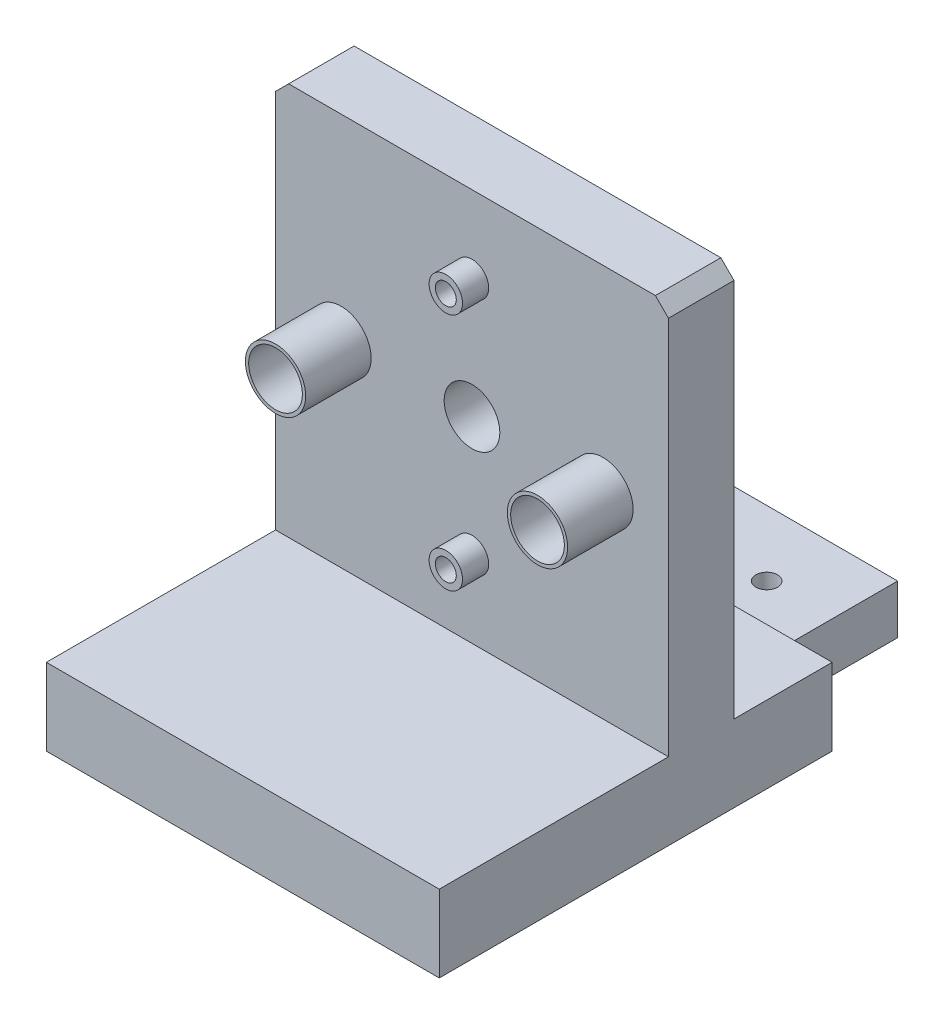
ISO-10303-21;
HEADER;
FILE_DESCRIPTION(('STEP AP214'),'2;1');
FILE_NAME('part.step','',(''),(''),'','','');
FILE_SCHEMA(('AUTOMOTIVE_DESIGN { 1 0 10303 214 1 1 1 1 }'));
ENDSEC;
DATA;
#1=APPLICATION_CONTEXT('core data for automotive mechanical design processes');
#2=APPLICATION_PROTOCOL_DEFINITION('international standard','automotive_design',2000,#1);
#3=PRODUCT_CONTEXT('',#1,'mechanical');
#4=PRODUCT('Part','Part','',(#3));
#5=PRODUCT_RELATED_PRODUCT_CATEGORY('part','',(#4));
#6=PRODUCT_DEFINITION_FORMATION('','',#4);
#7=PRODUCT_DEFINITION_CONTEXT('part definition',#1,'design');
#8=PRODUCT_DEFINITION('design','',#6,#7);
#9=PRODUCT_DEFINITION_SHAPE('','',#8);
#10=(LENGTH_UNIT() NAMED_UNIT(*) SI_UNIT(.MILLI.,.METRE.));
#11=(NAMED_UNIT(*) PLANE_ANGLE_UNIT() SI_UNIT($,.RADIAN.));
#12=(NAMED_UNIT(*) SI_UNIT($,.STERADIAN.) SOLID_ANGLE_UNIT());
#13=UNCERTAINTY_MEASURE_WITH_UNIT(LENGTH_MEASURE(1.E-05),#10,'distance_accuracy_value','');
#14=(GEOMETRIC_REPRESENTATION_CONTEXT(3) GLOBAL_UNCERTAINTY_ASSIGNED_CONTEXT((#13)) GLOBAL_UNIT_ASSIGNED_CONTEXT((#10,
#11,#12)) REPRESENTATION_CONTEXT('',''));
#15=CARTESIAN_POINT('',(0.,0.,0.));
#16=DIRECTION('',(0.,0.,1.));
#17=DIRECTION('',(1.,0.,0.));
#18=AXIS2_PLACEMENT_3D('',#15,#16,#17);
#19=CARTESIAN_POINT('',(-30.,-41.75,-35.));
#20=DIRECTION('',(0.,0.,1.));
#21=DIRECTION('',(1.,0.,0.));
#22=AXIS2_PLACEMENT_3D('',#19,#20,#21);
#23=PLANE('',#22);
#24=DIRECTION('',(-1.,0.,0.));
#25=VECTOR('',#24,1.);
#26=CARTESIAN_POINT('',(-20.,-34.25,-35.));
#27=LINE('',#26,#25);
#28=CARTESIAN_POINT('',(20.,-34.25,-35.));
#29=VERTEX_POINT('',#28);
#30=CARTESIAN_POINT('',(-20.,-34.25,-35.));
#31=VERTEX_POINT('',#30);
#32=EDGE_CURVE('E162',#29,#31,#27,.T.);
#33=ORIENTED_EDGE('',*,*,#32,.F.);
#34=DIRECTION('',(0.,-1.,0.));
#35=VECTOR('',#34,1.);
#36=CARTESIAN_POINT('',(20.,30.,-35.));
#37=LINE('',#36,#35);
#38=CARTESIAN_POINT('',(20.,-41.75,-35.));
#39=VERTEX_POINT('',#38);
#40=EDGE_CURVE('E199',#29,#39,#37,.T.);
#41=ORIENTED_EDGE('',*,*,#40,.T.);
#42=DIRECTION('',(1.,0.,0.));
#43=VECTOR('',#42,1.);
#44=CARTESIAN_POINT('',(-30.,-41.75,-35.));
#45=LINE('',#44,#43);
#46=CARTESIAN_POINT('',(-20.,-41.75,-35.));
#47=VERTEX_POINT('',#46);
#48=EDGE_CURVE('E215',#47,#39,#45,.T.);
#49=ORIENTED_EDGE('',*,*,#48,.F.);
#50=DIRECTION('',(0.,-1.,0.));
#51=VECTOR('',#50,1.);
#52=CARTESIAN_POINT('',(-20.,30.,-35.));
#53=LINE('',#52,#51);
#54=EDGE_CURVE('E174',#31,#47,#53,.T.);
#55=ORIENTED_EDGE('',*,*,#54,.F.);
#56=EDGE_LOOP('',(#33,#41,#49,#55));
#57=FACE_BOUND('',#56,.T.);
#58=ADVANCED_FACE('F40',(#57),#23,.F.);
#59=CARTESIAN_POINT('',(20.,30.,-35.));
#60=DIRECTION('',(-1.,0.,0.));
#61=DIRECTION('',(0.,0.,1.));
#62=AXIS2_PLACEMENT_3D('',#59,#60,#61);
#63=PLANE('',#62);
#64=DIRECTION('',(0.,0.,-1.));
#65=VECTOR('',#64,1.);
#66=CARTESIAN_POINT('',(20.,-34.25,-35.));
#67=LINE('',#66,#65);
#68=CARTESIAN_POINT('',(20.,-34.25,-15.));
#69=VERTEX_POINT('',#68);
#70=EDGE_CURVE('E156',#69,#29,#67,.T.);
#71=ORIENTED_EDGE('',*,*,#70,.F.);
#72=DIRECTION('',(0.,-1.,0.));
#73=VECTOR('',#72,1.);
#74=CARTESIAN_POINT('',(20.,30.,-15.));
#75=LINE('',#74,#73);
#76=CARTESIAN_POINT('',(20.,-41.75,-15.));
#77=VERTEX_POINT('',#76);
#78=EDGE_CURVE('E152',#69,#77,#75,.T.);
#79=ORIENTED_EDGE('',*,*,#78,.T.);
#80=DIRECTION('',(0.,0.,-1.));
#81=VECTOR('',#80,1.);
#82=CARTESIAN_POINT('',(20.,-41.75,-35.));
#83=LINE('',#82,#81);
#84=EDGE_CURVE('E191',#77,#39,#83,.T.);
#85=ORIENTED_EDGE('',*,*,#84,.T.);
#86=ORIENTED_EDGE('',*,*,#40,.F.);
#87=EDGE_LOOP('',(#71,#79,#85,#86));
#88=FACE_BOUND('',#87,.T.);
#89=ADVANCED_FACE('F435',(#88),#63,.F.);
#90=CARTESIAN_POINT('',(-20.,30.,-35.));
#91=DIRECTION('',(1.,0.,0.));
#92=DIRECTION('',(0.,0.,-1.));
#93=AXIS2_PLACEMENT_3D('',#90,#91,#92);
#94=PLANE('',#93);
#95=DIRECTION('',(0.,0.,1.));
#96=VECTOR('',#95,1.);
#97=CARTESIAN_POINT('',(-20.,-34.25,-35.));
#98=LINE('',#97,#96);
#99=CARTESIAN_POINT('',(-20.,-34.25,-15.));
#100=VERTEX_POINT('',#99);
#101=EDGE_CURVE('E157',#31,#100,#98,.T.);
#102=ORIENTED_EDGE('',*,*,#101,.F.);
#103=ORIENTED_EDGE('',*,*,#54,.T.);
#104=DIRECTION('',(0.,0.,1.));
#105=VECTOR('',#104,1.);
#106=CARTESIAN_POINT('',(-20.,-41.75,-35.));
#107=LINE('',#106,#105);
#108=CARTESIAN_POINT('',(-20.,-41.75,-15.));
#109=VERTEX_POINT('',#108);
#110=EDGE_CURVE('E170',#47,#109,#107,.T.);
#111=ORIENTED_EDGE('',*,*,#110,.T.);
#112=DIRECTION('',(0.,-1.,0.));
#113=VECTOR('',#112,1.);
#114=CARTESIAN_POINT('',(-20.,30.,-15.));
#115=LINE('',#114,#113);
#116=EDGE_CURVE('E149',#100,#109,#115,.T.);
#117=ORIENTED_EDGE('',*,*,#116,.F.);
#118=EDGE_LOOP('',(#102,#103,#111,#117));
#119=FACE_BOUND('',#118,.T.);
#120=ADVANCED_FACE('F168',(#119),#94,.F.);
#121=CARTESIAN_POINT('',(0.,0.,10.));
#122=DIRECTION('',(0.,0.,-1.));
#123=DIRECTION('',(-1.,0.,0.));
#124=AXIS2_PLACEMENT_3D('',#121,#122,#123);
#125=PLANE('',#124);
#126=CARTESIAN_POINT('',(0.,-18.25,10.));
#127=DIRECTION('',(0.,0.,-1.));
#128=DIRECTION('',(1.,0.,0.));
#129=AXIS2_PLACEMENT_3D('',#126,#127,#128);
#130=CIRCLE('',#129,2.55);
#131=CARTESIAN_POINT('',(2.55,-18.25,10.));
#132=VERTEX_POINT('',#131);
#133=EDGE_CURVE('E239',#132,#132,#130,.T.);
#134=ORIENTED_EDGE('',*,*,#133,.T.);
#135=EDGE_LOOP('',(#134));
#136=FACE_BOUND('',#135,.T.);
#137=CARTESIAN_POINT('',(-20.,0.,10.));
#138=DIRECTION('',(0.,0.,-1.));
#139=DIRECTION('',(-1.,0.,0.));
#140=AXIS2_PLACEMENT_3D('',#137,#138,#139);
#141=CIRCLE('',#140,4.6);
#142=CARTESIAN_POINT('',(-24.6,0.,10.));
#143=VERTEX_POINT('',#142);
#144=EDGE_CURVE('E330',#143,#143,#141,.F.);
#145=ORIENTED_EDGE('',*,*,#144,.F.);
#146=EDGE_LOOP('',(#145));
#147=FACE_BOUND('',#146,.T.);
#148=CARTESIAN_POINT('',(0.,0.,10.));
#149=DIRECTION('',(0.,0.,1.));
#150=DIRECTION('',(1.,0.,0.));
#151=AXIS2_PLACEMENT_3D('',#148,#149,#150);
#152=CIRCLE('',#151,4.25000000000002);
#153=CARTESIAN_POINT('',(4.25000000000002,0.,10.));
#154=VERTEX_POINT('',#153);
#155=EDGE_CURVE('E307',#154,#154,#152,.T.);
#156=ORIENTED_EDGE('',*,*,#155,.F.);
#157=EDGE_LOOP('',(#156));
#158=FACE_BOUND('',#157,.T.);
#159=DIRECTION('',(-1.,0.,0.));
#160=VECTOR('',#159,1.);
#161=CARTESIAN_POINT('',(-30.,30.,10.));
#162=LINE('',#161,#160);
#163=CARTESIAN_POINT('',(28.,30.,10.));
#164=VERTEX_POINT('',#163);
#165=CARTESIAN_POINT('',(-28.,30.,10.));
#166=VERTEX_POINT('',#165);
#167=EDGE_CURVE('E319',#164,#166,#162,.T.);
#168=ORIENTED_EDGE('',*,*,#167,.T.);
#169=DIRECTION('',(0.707106781186548,0.707106781186548,0.));
#170=VECTOR('',#169,1.);
#171=CARTESIAN_POINT('',(-30.,28.,10.));
#172=LINE('',#171,#170);
#173=CARTESIAN_POINT('',(-30.,28.,10.));
#174=VERTEX_POINT('',#173);
#175=EDGE_CURVE('E50',#166,#174,#172,.F.);
#176=ORIENTED_EDGE('',*,*,#175,.T.);
#177=DIRECTION('',(0.,-1.,0.));
#178=VECTOR('',#177,1.);
#179=CARTESIAN_POINT('',(-30.,-30.,10.));
#180=LINE('',#179,#178);
#181=CARTESIAN_POINT('',(-30.,-30.,10.));
#182=VERTEX_POINT('',#181);
#183=EDGE_CURVE('E323',#174,#182,#180,.T.);
#184=ORIENTED_EDGE('',*,*,#183,.T.);
#185=DIRECTION('',(1.,0.,0.));
#186=VECTOR('',#185,1.);
#187=CARTESIAN_POINT('',(-30.,-30.,10.));
#188=LINE('',#187,#186);
#189=CARTESIAN_POINT('',(30.,-30.,10.));
#190=VERTEX_POINT('',#189);
#191=EDGE_CURVE('E326',#182,#190,#188,.T.);
#192=ORIENTED_EDGE('',*,*,#191,.T.);
#193=DIRECTION('',(0.,1.,0.));
#194=VECTOR('',#193,1.);
#195=CARTESIAN_POINT('',(30.,-30.,10.));
#196=LINE('',#195,#194);
#197=CARTESIAN_POINT('',(30.,28.,10.));
#198=VERTEX_POINT('',#197);
#199=EDGE_CURVE('E316',#190,#198,#196,.T.);
#200=ORIENTED_EDGE('',*,*,#199,.T.);
#201=DIRECTION('',(0.707106781186548,-0.707106781186548,0.));
#202=VECTOR('',#201,1.);
#203=CARTESIAN_POINT('',(28.,30.,10.));
#204=LINE('',#203,#202);
#205=EDGE_CURVE('E374',#198,#164,#204,.F.);
#206=ORIENTED_EDGE('',*,*,#205,.T.);
#207=EDGE_LOOP('',(#168,#176,#184,#192,#200,#206));
#208=FACE_BOUND('',#207,.T.);
#209=CARTESIAN_POINT('',(20.,0.,10.));
#210=DIRECTION('',(0.,0.,-1.));
#211=DIRECTION('',(-1.,0.,0.));
#212=AXIS2_PLACEMENT_3D('',#209,#210,#211);
#213=CIRCLE('',#212,4.6);
#214=CARTESIAN_POINT('',(15.4,0.,10.));
#215=VERTEX_POINT('',#214);
#216=EDGE_CURVE('E260',#215,#215,#213,.T.);
#217=ORIENTED_EDGE('',*,*,#216,.T.);
#218=EDGE_LOOP('',(#217));
#219=FACE_BOUND('',#218,.T.);
#220=CARTESIAN_POINT('',(0.,18.25,10.));
#221=DIRECTION('',(0.,0.,-1.));
#222=DIRECTION('',(-1.,0.,0.));
#223=AXIS2_PLACEMENT_3D('',#220,#221,#222);
#224=CIRCLE('',#223,2.55);
#225=CARTESIAN_POINT('',(-2.55,18.25,10.));
#226=VERTEX_POINT('',#225);
#227=EDGE_CURVE('E345',#226,#226,#224,.F.);
#228=ORIENTED_EDGE('',*,*,#227,.F.);
#229=EDGE_LOOP('',(#228));
#230=FACE_BOUND('',#229,.T.);
#231=ADVANCED_FACE('F380',(#136,#147,#158,#208,#219,#230),#125,.F.);
#232=CARTESIAN_POINT('',(30.,-30.,10.));
#233=DIRECTION('',(-1.,0.,0.));
#234=DIRECTION('',(0.,0.,1.));
#235=AXIS2_PLACEMENT_3D('',#232,#233,#234);
#236=PLANE('',#235);
#237=DIRECTION('',(0.,1.,0.));
#238=VECTOR('',#237,1.);
#239=CARTESIAN_POINT('',(30.,-30.,0.));
#240=LINE('',#239,#238);
#241=CARTESIAN_POINT('',(30.,-30.,0.));
#242=VERTEX_POINT('',#241);
#243=CARTESIAN_POINT('',(30.,28.,0.));
#244=VERTEX_POINT('',#243);
#245=EDGE_CURVE('E315',#242,#244,#240,.T.);
#246=ORIENTED_EDGE('',*,*,#245,.T.);
#247=DIRECTION('',(0.,0.,1.));
#248=VECTOR('',#247,1.);
#249=CARTESIAN_POINT('',(30.,28.,10.));
#250=LINE('',#249,#248);
#251=EDGE_CURVE('E11',#244,#198,#250,.T.);
#252=ORIENTED_EDGE('',*,*,#251,.T.);
#253=ORIENTED_EDGE('',*,*,#199,.F.);
#254=DIRECTION('',(0.,0.,1.));
#255=VECTOR('',#254,1.);
#256=CARTESIAN_POINT('',(30.,-30.,-35.));
#257=LINE('',#256,#255);
#258=CARTESIAN_POINT('',(30.,-30.,45.));
#259=VERTEX_POINT('',#258);
#260=EDGE_CURVE('E173',#190,#259,#257,.T.);
#261=ORIENTED_EDGE('',*,*,#260,.T.);
#262=DIRECTION('',(0.,1.,0.));
#263=VECTOR('',#262,1.);
#264=CARTESIAN_POINT('',(30.,-41.75,45.));
#265=LINE('',#264,#263);
#266=CARTESIAN_POINT('',(30.,-41.75,45.));
#267=VERTEX_POINT('',#266);
#268=EDGE_CURVE('E231',#267,#259,#265,.T.);
#269=ORIENTED_EDGE('',*,*,#268,.F.);
#270=DIRECTION('',(0.,0.,1.));
#271=VECTOR('',#270,1.);
#272=CARTESIAN_POINT('',(30.,-41.75,-35.));
#273=LINE('',#272,#271);
#274=CARTESIAN_POINT('',(30.,-41.75,-15.));
#275=VERTEX_POINT('',#274);
#276=EDGE_CURVE('E204',#275,#267,#273,.T.);
#277=ORIENTED_EDGE('',*,*,#276,.F.);
#278=DIRECTION('',(0.,-1.,0.));
#279=VECTOR('',#278,1.);
#280=CARTESIAN_POINT('',(30.,30.,-15.));
#281=LINE('',#280,#279);
#282=CARTESIAN_POINT('',(30.,-30.,-15.));
#283=VERTEX_POINT('',#282);
#284=EDGE_CURVE('E195',#283,#275,#281,.T.);
#285=ORIENTED_EDGE('',*,*,#284,.F.);
#286=EDGE_CURVE('E178',#283,#242,#257,.T.);
#287=ORIENTED_EDGE('',*,*,#286,.T.);
#288=EDGE_LOOP('',(#246,#252,#253,#261,#269,#277,#285,#287));
#289=FACE_BOUND('',#288,.T.);
#290=ADVANCED_FACE('F399',(#289),#236,.F.);
#291=CARTESIAN_POINT('',(-30.,30.,10.));
#292=DIRECTION('',(0.,-1.,0.));
#293=DIRECTION('',(0.,0.,-1.));
#294=AXIS2_PLACEMENT_3D('',#291,#292,#293);
#295=PLANE('',#294);
#296=DIRECTION('',(-1.,0.,0.));
#297=VECTOR('',#296,1.);
#298=CARTESIAN_POINT('',(-30.,30.,0.));
#299=LINE('',#298,#297);
#300=CARTESIAN_POINT('',(28.,30.,0.));
#301=VERTEX_POINT('',#300);
#302=CARTESIAN_POINT('',(-28.,30.,0.));
#303=VERTEX_POINT('',#302);
#304=EDGE_CURVE('E333',#301,#303,#299,.T.);
#305=ORIENTED_EDGE('',*,*,#304,.T.);
#306=DIRECTION('',(0.,0.,1.));
#307=VECTOR('',#306,1.);
#308=CARTESIAN_POINT('',(-28.,30.,10.));
#309=LINE('',#308,#307);
#310=EDGE_CURVE('E63',#303,#166,#309,.T.);
#311=ORIENTED_EDGE('',*,*,#310,.T.);
#312=ORIENTED_EDGE('',*,*,#167,.F.);
#313=DIRECTION('',(0.,0.,-1.));
#314=VECTOR('',#313,1.);
#315=CARTESIAN_POINT('',(28.,30.,10.));
#316=LINE('',#315,#314);
#317=EDGE_CURVE('E368',#164,#301,#316,.T.);
#318=ORIENTED_EDGE('',*,*,#317,.T.);
#319=EDGE_LOOP('',(#305,#311,#312,#318));
#320=FACE_BOUND('',#319,.T.);
#321=ADVANCED_FACE('F394',(#320),#295,.F.);
#322=CARTESIAN_POINT('',(-30.,-30.,10.));
#323=DIRECTION('',(1.,0.,0.));
#324=DIRECTION('',(0.,0.,-1.));
#325=AXIS2_PLACEMENT_3D('',#322,#323,#324);
#326=PLANE('',#325);
#327=ORIENTED_EDGE('',*,*,#183,.F.);
#328=DIRECTION('',(0.,0.,-1.));
#329=VECTOR('',#328,1.);
#330=CARTESIAN_POINT('',(-30.,28.,10.));
#331=LINE('',#330,#329);
#332=CARTESIAN_POINT('',(-30.,28.,0.));
#333=VERTEX_POINT('',#332);
#334=EDGE_CURVE('E352',#174,#333,#331,.T.);
#335=ORIENTED_EDGE('',*,*,#334,.T.);
#336=DIRECTION('',(0.,-1.,0.));
#337=VECTOR('',#336,1.);
#338=CARTESIAN_POINT('',(-30.,-30.,0.));
#339=LINE('',#338,#337);
#340=CARTESIAN_POINT('',(-30.,-30.,0.));
#341=VERTEX_POINT('',#340);
#342=EDGE_CURVE('E336',#333,#341,#339,.T.);
#343=ORIENTED_EDGE('',*,*,#342,.T.);
#344=DIRECTION('',(0.,0.,-1.));
#345=VECTOR('',#344,1.);
#346=CARTESIAN_POINT('',(-30.,-30.,-35.));
#347=LINE('',#346,#345);
#348=CARTESIAN_POINT('',(-30.,-30.,-15.));
#349=VERTEX_POINT('',#348);
#350=EDGE_CURVE('E224',#341,#349,#347,.T.);
#351=ORIENTED_EDGE('',*,*,#350,.T.);
#352=DIRECTION('',(0.,-1.,0.));
#353=VECTOR('',#352,1.);
#354=CARTESIAN_POINT('',(-30.,30.,-15.));
#355=LINE('',#354,#353);
#356=CARTESIAN_POINT('',(-30.,-41.75,-15.));
#357=VERTEX_POINT('',#356);
#358=EDGE_CURVE('E180',#349,#357,#355,.T.);
#359=ORIENTED_EDGE('',*,*,#358,.T.);
#360=DIRECTION('',(0.,0.,-1.));
#361=VECTOR('',#360,1.);
#362=CARTESIAN_POINT('',(-30.,-41.75,-35.));
#363=LINE('',#362,#361);
#364=CARTESIAN_POINT('',(-30.,-41.75,45.));
#365=VERTEX_POINT('',#364);
#366=EDGE_CURVE('E211',#365,#357,#363,.T.);
#367=ORIENTED_EDGE('',*,*,#366,.F.);
#368=DIRECTION('',(0.,1.,0.));
#369=VECTOR('',#368,1.);
#370=CARTESIAN_POINT('',(-30.,-41.75,45.));
#371=LINE('',#370,#369);
#372=CARTESIAN_POINT('',(-30.,-30.,45.));
#373=VERTEX_POINT('',#372);
#374=EDGE_CURVE('E218',#365,#373,#371,.T.);
#375=ORIENTED_EDGE('',*,*,#374,.T.);
#376=EDGE_CURVE('E208',#373,#182,#347,.T.);
#377=ORIENTED_EDGE('',*,*,#376,.T.);
#378=EDGE_LOOP('',(#327,#335,#343,#351,#359,#367,#375,#377));
#379=FACE_BOUND('',#378,.T.);
#380=ADVANCED_FACE('F386',(#379),#326,.F.);
#381=CARTESIAN_POINT('',(0.,0.,0.));
#382=DIRECTION('',(0.,0.,-1.));
#383=DIRECTION('',(-1.,0.,0.));
#384=AXIS2_PLACEMENT_3D('',#381,#382,#383);
#385=PLANE('',#384);
#386=CARTESIAN_POINT('',(0.,18.25,0.));
#387=DIRECTION('',(0.,0.,-1.));
#388=DIRECTION('',(-1.,0.,0.));
#389=AXIS2_PLACEMENT_3D('',#386,#387,#388);
#390=CIRCLE('',#389,1.60000000000001);
#391=CARTESIAN_POINT('',(-1.60000000000001,18.25,0.));
#392=VERTEX_POINT('',#391);
#393=EDGE_CURVE('E283',#392,#392,#390,.T.);
#394=ORIENTED_EDGE('',*,*,#393,.F.);
#395=EDGE_LOOP('',(#394));
#396=FACE_BOUND('',#395,.T.);
#397=CARTESIAN_POINT('',(0.,-18.25,0.));
#398=DIRECTION('',(0.,0.,-1.));
#399=DIRECTION('',(-1.,0.,0.));
#400=AXIS2_PLACEMENT_3D('',#397,#398,#399);
#401=CIRCLE('',#400,1.60000000000001);
#402=CARTESIAN_POINT('',(-1.60000000000001,-18.25,0.));
#403=VERTEX_POINT('',#402);
#404=EDGE_CURVE('E287',#403,#403,#401,.T.);
#405=ORIENTED_EDGE('',*,*,#404,.F.);
#406=EDGE_LOOP('',(#405));
#407=FACE_BOUND('',#406,.T.);
#408=CARTESIAN_POINT('',(20.,0.,0.));
#409=DIRECTION('',(0.,0.,1.));
#410=DIRECTION('',(1.,0.,0.));
#411=AXIS2_PLACEMENT_3D('',#408,#409,#410);
#412=CIRCLE('',#411,4.);
#413=CARTESIAN_POINT('',(24.,0.,0.));
#414=VERTEX_POINT('',#413);
#415=EDGE_CURVE('E295',#414,#414,#412,.T.);
#416=ORIENTED_EDGE('',*,*,#415,.T.);
#417=EDGE_LOOP('',(#416));
#418=FACE_BOUND('',#417,.T.);
#419=CARTESIAN_POINT('',(-20.,0.,0.));
#420=DIRECTION('',(0.,0.,1.));
#421=DIRECTION('',(1.,0.,0.));
#422=AXIS2_PLACEMENT_3D('',#419,#420,#421);
#423=CIRCLE('',#422,4.);
#424=CARTESIAN_POINT('',(-16.,0.,0.));
#425=VERTEX_POINT('',#424);
#426=EDGE_CURVE('E303',#425,#425,#423,.T.);
#427=ORIENTED_EDGE('',*,*,#426,.T.);
#428=EDGE_LOOP('',(#427));
#429=FACE_BOUND('',#428,.T.);
#430=CARTESIAN_POINT('',(0.,0.,0.));
#431=DIRECTION('',(0.,0.,-1.));
#432=DIRECTION('',(-1.,0.,0.));
#433=AXIS2_PLACEMENT_3D('',#430,#431,#432);
#434=CIRCLE('',#433,4.25000000000001);
#435=CARTESIAN_POINT('',(-4.25000000000001,0.,0.));
#436=VERTEX_POINT('',#435);
#437=EDGE_CURVE('E311',#436,#436,#434,.T.);
#438=ORIENTED_EDGE('',*,*,#437,.F.);
#439=EDGE_LOOP('',(#438));
#440=FACE_BOUND('',#439,.T.);
#441=ORIENTED_EDGE('',*,*,#342,.F.);
#442=DIRECTION('',(-0.707106781186548,-0.707106781186548,0.));
#443=VECTOR('',#442,1.);
#444=CARTESIAN_POINT('',(-29.,29.,0.));
#445=LINE('',#444,#443);
#446=EDGE_CURVE('E365',#333,#303,#445,.F.);
#447=ORIENTED_EDGE('',*,*,#446,.T.);
#448=ORIENTED_EDGE('',*,*,#304,.F.);
#449=DIRECTION('',(-0.707106781186548,0.707106781186548,0.));
#450=VECTOR('',#449,1.);
#451=CARTESIAN_POINT('',(29.,29.,0.));
#452=LINE('',#451,#450);
#453=EDGE_CURVE('E362',#301,#244,#452,.F.);
#454=ORIENTED_EDGE('',*,*,#453,.T.);
#455=ORIENTED_EDGE('',*,*,#245,.F.);
#456=DIRECTION('',(1.,0.,0.));
#457=VECTOR('',#456,1.);
#458=CARTESIAN_POINT('',(-30.,-30.,0.));
#459=LINE('',#458,#457);
#460=EDGE_CURVE('E320',#341,#242,#459,.T.);
#461=ORIENTED_EDGE('',*,*,#460,.F.);
#462=EDGE_LOOP('',(#441,#447,#448,#454,#455,#461));
#463=FACE_BOUND('',#462,.T.);
#464=ADVANCED_FACE('F392',(#396,#407,#418,#429,#440,#463),#385,.T.);
#465=CARTESIAN_POINT('',(0.,0.,10.));
#466=DIRECTION('',(0.,0.,1.));
#467=DIRECTION('',(1.,0.,0.));
#468=AXIS2_PLACEMENT_3D('',#465,#466,#467);
#469=CYLINDRICAL_SURFACE('',#468,4.25000000000001);
#470=ORIENTED_EDGE('',*,*,#437,.T.);
#471=EDGE_LOOP('',(#470));
#472=FACE_BOUND('',#471,.T.);
#473=ORIENTED_EDGE('',*,*,#155,.T.);
#474=EDGE_LOOP('',(#473));
#475=FACE_BOUND('',#474,.T.);
#476=ADVANCED_FACE('F501',(#472,#475),#469,.F.);
#477=CARTESIAN_POINT('',(-20.,0.,10.));
#478=DIRECTION('',(0.,0.,1.));
#479=DIRECTION('',(1.,0.,0.));
#480=AXIS2_PLACEMENT_3D('',#477,#478,#479);
#481=CYLINDRICAL_SURFACE('',#480,4.00000000000001);
#482=ORIENTED_EDGE('',*,*,#426,.F.);
#483=EDGE_LOOP('',(#482));
#484=FACE_BOUND('',#483,.T.);
#485=CARTESIAN_POINT('',(-20.,0.,9.75857864376273));
#486=DIRECTION('',(0.,0.,1.));
#487=DIRECTION('',(1.,0.,0.));
#488=AXIS2_PLACEMENT_3D('',#485,#486,#487);
#489=CIRCLE('',#488,4.00000000000001);
#490=CARTESIAN_POINT('',(-16.,0.,9.75857864376273));
#491=VERTEX_POINT('',#490);
#492=EDGE_CURVE('E299',#491,#491,#489,.T.);
#493=ORIENTED_EDGE('',*,*,#492,.T.);
#494=EDGE_LOOP('',(#493));
#495=FACE_BOUND('',#494,.T.);
#496=ADVANCED_FACE('F497',(#484,#495),#481,.F.);
#497=CARTESIAN_POINT('',(-20.,0.,10.));
#498=DIRECTION('',(0.,0.,1.));
#499=DIRECTION('',(1.,0.,0.));
#500=AXIS2_PLACEMENT_3D('',#497,#498,#499);
#501=CONICAL_SURFACE('',#500,4.1,0.392699081698732);
#502=ORIENTED_EDGE('',*,*,#492,.F.);
#503=EDGE_LOOP('',(#502));
#504=FACE_BOUND('',#503,.T.);
#505=CARTESIAN_POINT('',(-20.,0.,10.));
#506=DIRECTION('',(0.,0.,1.));
#507=DIRECTION('',(1.,0.,0.));
#508=AXIS2_PLACEMENT_3D('',#505,#506,#507);
#509=CIRCLE('',#508,4.1);
#510=CARTESIAN_POINT('',(-15.9,0.,10.));
#511=VERTEX_POINT('',#510);
#512=EDGE_CURVE('E268',#511,#511,#509,.T.);
#513=ORIENTED_EDGE('',*,*,#512,.T.);
#514=EDGE_LOOP('',(#513));
#515=FACE_BOUND('',#514,.T.);
#516=ADVANCED_FACE('F493',(#504,#515),#501,.F.);
#517=CARTESIAN_POINT('',(20.,0.,10.));
#518=DIRECTION('',(0.,0.,1.));
#519=DIRECTION('',(1.,0.,0.));
#520=AXIS2_PLACEMENT_3D('',#517,#518,#519);
#521=CYLINDRICAL_SURFACE('',#520,4.00000000000001);
#522=ORIENTED_EDGE('',*,*,#415,.F.);
#523=EDGE_LOOP('',(#522));
#524=FACE_BOUND('',#523,.T.);
#525=CARTESIAN_POINT('',(20.,0.,9.75857864376273));
#526=DIRECTION('',(0.,0.,1.));
#527=DIRECTION('',(1.,0.,0.));
#528=AXIS2_PLACEMENT_3D('',#525,#526,#527);
#529=CIRCLE('',#528,4.00000000000001);
#530=CARTESIAN_POINT('',(24.,0.,9.75857864376273));
#531=VERTEX_POINT('',#530);
#532=EDGE_CURVE('E291',#531,#531,#529,.T.);
#533=ORIENTED_EDGE('',*,*,#532,.T.);
#534=EDGE_LOOP('',(#533));
#535=FACE_BOUND('',#534,.T.);
#536=ADVANCED_FACE('F489',(#524,#535),#521,.F.);
#537=CARTESIAN_POINT('',(20.,0.,10.));
#538=DIRECTION('',(0.,0.,1.));
#539=DIRECTION('',(1.,0.,0.));
#540=AXIS2_PLACEMENT_3D('',#537,#538,#539);
#541=CONICAL_SURFACE('',#540,4.1,0.392699081698732);
#542=ORIENTED_EDGE('',*,*,#532,.F.);
#543=EDGE_LOOP('',(#542));
#544=FACE_BOUND('',#543,.T.);
#545=CARTESIAN_POINT('',(20.,0.,10.));
#546=DIRECTION('',(0.,0.,-1.));
#547=DIRECTION('',(-1.,0.,0.));
#548=AXIS2_PLACEMENT_3D('',#545,#546,#547);
#549=CIRCLE('',#548,4.1);
#550=CARTESIAN_POINT('',(15.9,0.,10.));
#551=VERTEX_POINT('',#550);
#552=EDGE_CURVE('E255',#551,#551,#549,.T.);
#553=ORIENTED_EDGE('',*,*,#552,.F.);
#554=EDGE_LOOP('',(#553));
#555=FACE_BOUND('',#554,.T.);
#556=ADVANCED_FACE('F485',(#544,#555),#541,.F.);
#557=CARTESIAN_POINT('',(0.,-18.25,0.));
#558=DIRECTION('',(0.,0.,-1.));
#559=DIRECTION('',(-1.,0.,0.));
#560=AXIS2_PLACEMENT_3D('',#557,#558,#559);
#561=CYLINDRICAL_SURFACE('',#560,1.60000000000001);
#562=ORIENTED_EDGE('',*,*,#404,.T.);
#563=EDGE_LOOP('',(#562));
#564=FACE_BOUND('',#563,.T.);
#565=CARTESIAN_POINT('',(0.,-18.25,14.));
#566=DIRECTION('',(0.,0.,-1.));
#567=DIRECTION('',(1.,0.,0.));
#568=AXIS2_PLACEMENT_3D('',#565,#566,#567);
#569=CIRCLE('',#568,1.6);
#570=CARTESIAN_POINT('',(1.6,-18.25,14.));
#571=VERTEX_POINT('',#570);
#572=EDGE_CURVE('E235',#571,#571,#569,.T.);
#573=ORIENTED_EDGE('',*,*,#572,.F.);
#574=EDGE_LOOP('',(#573));
#575=FACE_BOUND('',#574,.T.);
#576=ADVANCED_FACE('F481',(#564,#575),#561,.F.);
#577=CARTESIAN_POINT('',(0.,18.25,0.));
#578=DIRECTION('',(0.,0.,-1.));
#579=DIRECTION('',(-1.,0.,0.));
#580=AXIS2_PLACEMENT_3D('',#577,#578,#579);
#581=CYLINDRICAL_SURFACE('',#580,1.60000000000001);
#582=ORIENTED_EDGE('',*,*,#393,.T.);
#583=EDGE_LOOP('',(#582));
#584=FACE_BOUND('',#583,.T.);
#585=CARTESIAN_POINT('',(0.,18.25,14.));
#586=DIRECTION('',(0.,0.,1.));
#587=DIRECTION('',(1.,0.,0.));
#588=AXIS2_PLACEMENT_3D('',#585,#586,#587);
#589=CIRCLE('',#588,1.6);
#590=CARTESIAN_POINT('',(1.6,18.25,14.));
#591=VERTEX_POINT('',#590);
#592=EDGE_CURVE('E244',#591,#591,#589,.T.);
#593=ORIENTED_EDGE('',*,*,#592,.T.);
#594=EDGE_LOOP('',(#593));
#595=FACE_BOUND('',#594,.T.);
#596=ADVANCED_FACE('F474',(#584,#595),#581,.F.);
#597=CARTESIAN_POINT('',(-20.,0.,20.));
#598=DIRECTION('',(0.,0.,1.));
#599=DIRECTION('',(1.,0.,0.));
#600=AXIS2_PLACEMENT_3D('',#597,#598,#599);
#601=PLANE('',#600);
#602=CARTESIAN_POINT('',(-20.,0.,20.));
#603=DIRECTION('',(0.,0.,1.));
#604=DIRECTION('',(1.,0.,0.));
#605=AXIS2_PLACEMENT_3D('',#602,#603,#604);
#606=CIRCLE('',#605,4.6);
#607=CARTESIAN_POINT('',(-15.4,0.,20.));
#608=VERTEX_POINT('',#607);
#609=EDGE_CURVE('E276',#608,#608,#606,.T.);
#610=ORIENTED_EDGE('',*,*,#609,.T.);
#611=EDGE_LOOP('',(#610));
#612=FACE_BOUND('',#611,.T.);
#613=CARTESIAN_POINT('',(-20.,0.,20.));
#614=DIRECTION('',(0.,0.,1.));
#615=DIRECTION('',(1.,0.,0.));
#616=AXIS2_PLACEMENT_3D('',#613,#614,#615);
#617=CIRCLE('',#616,4.1);
#618=CARTESIAN_POINT('',(-15.9,0.,20.));
#619=VERTEX_POINT('',#618);
#620=EDGE_CURVE('E272',#619,#619,#617,.T.);
#621=ORIENTED_EDGE('',*,*,#620,.F.);
#622=EDGE_LOOP('',(#621));
#623=FACE_BOUND('',#622,.T.);
#624=ADVANCED_FACE('F471',(#612,#623),#601,.T.);
#625=CARTESIAN_POINT('',(-20.,0.,20.));
#626=DIRECTION('',(0.,0.,-1.));
#627=DIRECTION('',(-1.,0.,0.));
#628=AXIS2_PLACEMENT_3D('',#625,#626,#627);
#629=CYLINDRICAL_SURFACE('',#628,4.6);
#630=ORIENTED_EDGE('',*,*,#609,.F.);
#631=EDGE_LOOP('',(#630));
#632=FACE_BOUND('',#631,.T.);
#633=ORIENTED_EDGE('',*,*,#144,.T.);
#634=EDGE_LOOP('',(#633));
#635=FACE_BOUND('',#634,.T.);
#636=ADVANCED_FACE('F469',(#632,#635),#629,.T.);
#637=CARTESIAN_POINT('',(-20.,0.,20.));
#638=DIRECTION('',(0.,0.,-1.));
#639=DIRECTION('',(-1.,0.,0.));
#640=AXIS2_PLACEMENT_3D('',#637,#638,#639);
#641=CYLINDRICAL_SURFACE('',#640,4.1);
#642=ORIENTED_EDGE('',*,*,#620,.T.);
#643=EDGE_LOOP('',(#642));
#644=FACE_BOUND('',#643,.T.);
#645=ORIENTED_EDGE('',*,*,#512,.F.);
#646=EDGE_LOOP('',(#645));
#647=FACE_BOUND('',#646,.T.);
#648=ADVANCED_FACE('F465',(#644,#647),#641,.F.);
#649=CARTESIAN_POINT('',(20.,0.,20.));
#650=DIRECTION('',(0.,0.,-1.));
#651=DIRECTION('',(-1.,0.,0.));
#652=AXIS2_PLACEMENT_3D('',#649,#650,#651);
#653=CYLINDRICAL_SURFACE('',#652,4.6);
#654=CARTESIAN_POINT('',(20.,0.,20.));
#655=DIRECTION('',(0.,0.,-1.));
#656=DIRECTION('',(-1.,0.,0.));
#657=AXIS2_PLACEMENT_3D('',#654,#655,#656);
#658=CIRCLE('',#657,4.6);
#659=CARTESIAN_POINT('',(15.4,0.,20.));
#660=VERTEX_POINT('',#659);
#661=EDGE_CURVE('E264',#660,#660,#658,.T.);
#662=ORIENTED_EDGE('',*,*,#661,.T.);
#663=EDGE_LOOP('',(#662));
#664=FACE_BOUND('',#663,.T.);
#665=ORIENTED_EDGE('',*,*,#216,.F.);
#666=EDGE_LOOP('',(#665));
#667=FACE_BOUND('',#666,.T.);
#668=ADVANCED_FACE('F461',(#664,#667),#653,.T.);
#669=CARTESIAN_POINT('',(20.,0.,20.));
#670=DIRECTION('',(0.,0.,1.));
#671=DIRECTION('',(-1.,0.,0.));
#672=AXIS2_PLACEMENT_3D('',#669,#670,#671);
#673=PLANE('',#672);
#674=CARTESIAN_POINT('',(20.,0.,20.));
#675=DIRECTION('',(0.,0.,-1.));
#676=DIRECTION('',(-1.,0.,0.));
#677=AXIS2_PLACEMENT_3D('',#674,#675,#676);
#678=CIRCLE('',#677,4.1);
#679=CARTESIAN_POINT('',(15.9,0.,20.));
#680=VERTEX_POINT('',#679);
#681=EDGE_CURVE('E256',#680,#680,#678,.T.);
#682=ORIENTED_EDGE('',*,*,#681,.T.);
#683=EDGE_LOOP('',(#682));
#684=FACE_BOUND('',#683,.T.);
#685=ORIENTED_EDGE('',*,*,#661,.F.);
#686=EDGE_LOOP('',(#685));
#687=FACE_BOUND('',#686,.T.);
#688=ADVANCED_FACE('F457',(#684,#687),#673,.T.);
#689=CARTESIAN_POINT('',(20.,0.,20.));
#690=DIRECTION('',(0.,0.,-1.));
#691=DIRECTION('',(-1.,0.,0.));
#692=AXIS2_PLACEMENT_3D('',#689,#690,#691);
#693=CYLINDRICAL_SURFACE('',#692,4.1);
#694=ORIENTED_EDGE('',*,*,#681,.F.);
#695=EDGE_LOOP('',(#694));
#696=FACE_BOUND('',#695,.T.);
#697=ORIENTED_EDGE('',*,*,#552,.T.);
#698=EDGE_LOOP('',(#697));
#699=FACE_BOUND('',#698,.T.);
#700=ADVANCED_FACE('F450',(#696,#699),#693,.F.);
#701=CARTESIAN_POINT('',(0.,18.25,14.));
#702=DIRECTION('',(0.,0.,1.));
#703=DIRECTION('',(1.,0.,0.));
#704=AXIS2_PLACEMENT_3D('',#701,#702,#703);
#705=PLANE('',#704);
#706=CARTESIAN_POINT('',(0.,18.25,14.));
#707=DIRECTION('',(0.,0.,1.));
#708=DIRECTION('',(1.,0.,0.));
#709=AXIS2_PLACEMENT_3D('',#706,#707,#708);
#710=CIRCLE('',#709,2.55);
#711=CARTESIAN_POINT('',(2.55,18.25,14.));
#712=VERTEX_POINT('',#711);
#713=EDGE_CURVE('E251',#712,#712,#710,.T.);
#714=ORIENTED_EDGE('',*,*,#713,.T.);
#715=EDGE_LOOP('',(#714));
#716=FACE_BOUND('',#715,.T.);
#717=ORIENTED_EDGE('',*,*,#592,.F.);
#718=EDGE_LOOP('',(#717));
#719=FACE_BOUND('',#718,.T.);
#720=ADVANCED_FACE('F447',(#716,#719),#705,.T.);
#721=CARTESIAN_POINT('',(0.,18.25,14.));
#722=DIRECTION('',(0.,0.,-1.));
#723=DIRECTION('',(-1.,0.,0.));
#724=AXIS2_PLACEMENT_3D('',#721,#722,#723);
#725=CYLINDRICAL_SURFACE('',#724,2.55);
#726=ORIENTED_EDGE('',*,*,#713,.F.);
#727=EDGE_LOOP('',(#726));
#728=FACE_BOUND('',#727,.T.);
#729=ORIENTED_EDGE('',*,*,#227,.T.);
#730=EDGE_LOOP('',(#729));
#731=FACE_BOUND('',#730,.T.);
#732=ADVANCED_FACE('F445',(#728,#731),#725,.T.);
#733=CARTESIAN_POINT('',(0.,-18.25,14.));
#734=DIRECTION('',(0.,0.,-1.));
#735=DIRECTION('',(-1.,0.,0.));
#736=AXIS2_PLACEMENT_3D('',#733,#734,#735);
#737=CYLINDRICAL_SURFACE('',#736,2.55);
#738=CARTESIAN_POINT('',(0.,-18.25,14.));
#739=DIRECTION('',(0.,0.,-1.));
#740=DIRECTION('',(1.,0.,0.));
#741=AXIS2_PLACEMENT_3D('',#738,#739,#740);
#742=CIRCLE('',#741,2.55);
#743=CARTESIAN_POINT('',(2.55,-18.25,14.));
#744=VERTEX_POINT('',#743);
#745=EDGE_CURVE('E240',#744,#744,#742,.T.);
#746=ORIENTED_EDGE('',*,*,#745,.T.);
#747=EDGE_LOOP('',(#746));
#748=FACE_BOUND('',#747,.T.);
#749=ORIENTED_EDGE('',*,*,#133,.F.);
#750=EDGE_LOOP('',(#749));
#751=FACE_BOUND('',#750,.T.);
#752=ADVANCED_FACE('F428',(#748,#751),#737,.T.);
#753=CARTESIAN_POINT('',(0.,-18.25,14.));
#754=DIRECTION('',(0.,0.,1.));
#755=DIRECTION('',(1.,0.,0.));
#756=AXIS2_PLACEMENT_3D('',#753,#754,#755);
#757=PLANE('',#756);
#758=ORIENTED_EDGE('',*,*,#572,.T.);
#759=EDGE_LOOP('',(#758));
#760=FACE_BOUND('',#759,.T.);
#761=ORIENTED_EDGE('',*,*,#745,.F.);
#762=EDGE_LOOP('',(#761));
#763=FACE_BOUND('',#762,.T.);
#764=ADVANCED_FACE('F421',(#760,#763),#757,.T.);
#765=CARTESIAN_POINT('',(0.,-30.,0.));
#766=DIRECTION('',(0.,1.,0.));
#767=DIRECTION('',(0.,0.,1.));
#768=AXIS2_PLACEMENT_3D('',#765,#766,#767);
#769=PLANE('',#768);
#770=ORIENTED_EDGE('',*,*,#191,.F.);
#771=ORIENTED_EDGE('',*,*,#376,.F.);
#772=DIRECTION('',(-1.,0.,0.));
#773=VECTOR('',#772,1.);
#774=CARTESIAN_POINT('',(-30.,-30.,45.));
#775=LINE('',#774,#773);
#776=EDGE_CURVE('E221',#259,#373,#775,.T.);
#777=ORIENTED_EDGE('',*,*,#776,.F.);
#778=ORIENTED_EDGE('',*,*,#260,.F.);
#779=EDGE_LOOP('',(#770,#771,#777,#778));
#780=FACE_BOUND('',#779,.T.);
#781=ADVANCED_FACE('F419',(#780),#769,.T.);
#782=CARTESIAN_POINT('',(-30.,-41.75,45.));
#783=DIRECTION('',(0.,0.,-1.));
#784=DIRECTION('',(-1.,0.,0.));
#785=AXIS2_PLACEMENT_3D('',#782,#783,#784);
#786=PLANE('',#785);
#787=ORIENTED_EDGE('',*,*,#776,.T.);
#788=ORIENTED_EDGE('',*,*,#374,.F.);
#789=DIRECTION('',(-1.,0.,0.));
#790=VECTOR('',#789,1.);
#791=CARTESIAN_POINT('',(-30.,-41.75,45.));
#792=LINE('',#791,#790);
#793=EDGE_CURVE('E207',#267,#365,#792,.T.);
#794=ORIENTED_EDGE('',*,*,#793,.F.);
#795=ORIENTED_EDGE('',*,*,#268,.T.);
#796=EDGE_LOOP('',(#787,#788,#794,#795));
#797=FACE_BOUND('',#796,.T.);
#798=ADVANCED_FACE('F416',(#797),#786,.F.);
#799=CARTESIAN_POINT('',(0.,-41.75,0.));
#800=DIRECTION('',(0.,1.,0.));
#801=DIRECTION('',(0.,0.,1.));
#802=AXIS2_PLACEMENT_3D('',#799,#800,#801);
#803=PLANE('',#802);
#804=CARTESIAN_POINT('',(10.,-41.75,-25.));
#805=DIRECTION('',(0.,-1.,0.));
#806=DIRECTION('',(0.,0.,-1.));
#807=AXIS2_PLACEMENT_3D('',#804,#805,#806);
#808=CIRCLE('',#807,1.65000000000001);
#809=CARTESIAN_POINT('',(10.,-41.75,-26.65));
#810=VERTEX_POINT('',#809);
#811=EDGE_CURVE('E358',#810,#810,#808,.T.);
#812=ORIENTED_EDGE('',*,*,#811,.F.);
#813=EDGE_LOOP('',(#812));
#814=FACE_BOUND('',#813,.T.);
#815=CARTESIAN_POINT('',(-10.,-41.75,-25.));
#816=DIRECTION('',(0.,-1.,0.));
#817=DIRECTION('',(0.,0.,-1.));
#818=AXIS2_PLACEMENT_3D('',#815,#816,#817);
#819=CIRCLE('',#818,1.65000000000001);
#820=CARTESIAN_POINT('',(-10.,-41.75,-26.65));
#821=VERTEX_POINT('',#820);
#822=EDGE_CURVE('E357',#821,#821,#819,.T.);
#823=ORIENTED_EDGE('',*,*,#822,.F.);
#824=EDGE_LOOP('',(#823));
#825=FACE_BOUND('',#824,.T.);
#826=ORIENTED_EDGE('',*,*,#366,.T.);
#827=DIRECTION('',(-1.,0.,0.));
#828=VECTOR('',#827,1.);
#829=CARTESIAN_POINT('',(-20.,-41.75,-15.));
#830=LINE('',#829,#828);
#831=EDGE_CURVE('E198',#109,#357,#830,.T.);
#832=ORIENTED_EDGE('',*,*,#831,.F.);
#833=ORIENTED_EDGE('',*,*,#110,.F.);
#834=ORIENTED_EDGE('',*,*,#48,.T.);
#835=ORIENTED_EDGE('',*,*,#84,.F.);
#836=DIRECTION('',(-1.,0.,0.));
#837=VECTOR('',#836,1.);
#838=CARTESIAN_POINT('',(20.,-41.75,-15.));
#839=LINE('',#838,#837);
#840=EDGE_CURVE('E188',#275,#77,#839,.T.);
#841=ORIENTED_EDGE('',*,*,#840,.F.);
#842=ORIENTED_EDGE('',*,*,#276,.T.);
#843=ORIENTED_EDGE('',*,*,#793,.T.);
#844=EDGE_LOOP('',(#826,#832,#833,#834,#835,#841,#842,#843));
#845=FACE_BOUND('',#844,.T.);
#846=ADVANCED_FACE('F410',(#814,#825,#845),#803,.F.);
#847=DIRECTION('',(1.,0.,0.));
#848=VECTOR('',#847,1.);
#849=CARTESIAN_POINT('',(0.,-30.,-15.));
#850=LINE('',#849,#848);
#851=EDGE_CURVE('E349',#349,#283,#850,.T.);
#852=ORIENTED_EDGE('',*,*,#851,.F.);
#853=ORIENTED_EDGE('',*,*,#350,.F.);
#854=ORIENTED_EDGE('',*,*,#460,.T.);
#855=ORIENTED_EDGE('',*,*,#286,.F.);
#856=EDGE_LOOP('',(#852,#853,#854,#855));
#857=FACE_BOUND('',#856,.T.);
#858=ADVANCED_FACE('F405',(#857),#769,.T.);
#859=CARTESIAN_POINT('',(-20.,30.,-15.));
#860=DIRECTION('',(0.,0.,1.));
#861=DIRECTION('',(1.,0.,0.));
#862=AXIS2_PLACEMENT_3D('',#859,#860,#861);
#863=PLANE('',#862);
#864=ORIENTED_EDGE('',*,*,#358,.F.);
#865=ORIENTED_EDGE('',*,*,#851,.T.);
#866=ORIENTED_EDGE('',*,*,#284,.T.);
#867=ORIENTED_EDGE('',*,*,#840,.T.);
#868=ORIENTED_EDGE('',*,*,#78,.F.);
#869=DIRECTION('',(1.,0.,0.));
#870=VECTOR('',#869,1.);
#871=CARTESIAN_POINT('',(-20.,-34.25,-15.));
#872=LINE('',#871,#870);
#873=EDGE_CURVE('E144',#100,#69,#872,.T.);
#874=ORIENTED_EDGE('',*,*,#873,.F.);
#875=ORIENTED_EDGE('',*,*,#116,.T.);
#876=ORIENTED_EDGE('',*,*,#831,.T.);
#877=EDGE_LOOP('',(#864,#865,#866,#867,#868,#874,#875,#876));
#878=FACE_BOUND('',#877,.T.);
#879=ADVANCED_FACE('F147',(#878),#863,.F.);
#880=CARTESIAN_POINT('',(0.,-34.25,0.));
#881=DIRECTION('',(0.,1.,0.));
#882=DIRECTION('',(0.,0.,1.));
#883=AXIS2_PLACEMENT_3D('',#880,#881,#882);
#884=PLANE('',#883);
#885=CARTESIAN_POINT('',(10.,-34.25,-25.));
#886=DIRECTION('',(0.,1.,0.));
#887=DIRECTION('',(0.,0.,1.));
#888=AXIS2_PLACEMENT_3D('',#885,#886,#887);
#889=CIRCLE('',#888,1.65000000000001);
#890=CARTESIAN_POINT('',(10.,-34.25,-23.35));
#891=VERTEX_POINT('',#890);
#892=EDGE_CURVE('E353',#891,#891,#889,.T.);
#893=ORIENTED_EDGE('',*,*,#892,.F.);
#894=EDGE_LOOP('',(#893));
#895=FACE_BOUND('',#894,.T.);
#896=CARTESIAN_POINT('',(-10.,-34.25,-25.));
#897=DIRECTION('',(0.,1.,0.));
#898=DIRECTION('',(0.,0.,1.));
#899=AXIS2_PLACEMENT_3D('',#896,#897,#898);
#900=CIRCLE('',#899,1.65000000000001);
#901=CARTESIAN_POINT('',(-10.,-34.25,-23.35));
#902=VERTEX_POINT('',#901);
#903=EDGE_CURVE('E166',#902,#902,#900,.T.);
#904=ORIENTED_EDGE('',*,*,#903,.F.);
#905=EDGE_LOOP('',(#904));
#906=FACE_BOUND('',#905,.T.);
#907=ORIENTED_EDGE('',*,*,#101,.T.);
#908=ORIENTED_EDGE('',*,*,#873,.T.);
#909=ORIENTED_EDGE('',*,*,#70,.T.);
#910=ORIENTED_EDGE('',*,*,#32,.T.);
#911=EDGE_LOOP('',(#907,#908,#909,#910));
#912=FACE_BOUND('',#911,.T.);
#913=ADVANCED_FACE('F160',(#895,#906,#912),#884,.T.);
#914=CARTESIAN_POINT('',(-10.,-41.75,-25.));
#915=DIRECTION('',(0.,-1.,0.));
#916=DIRECTION('',(0.,0.,-1.));
#917=AXIS2_PLACEMENT_3D('',#914,#915,#916);
#918=CYLINDRICAL_SURFACE('',#917,1.65000000000001);
#919=ORIENTED_EDGE('',*,*,#903,.T.);
#920=EDGE_LOOP('',(#919));
#921=FACE_BOUND('',#920,.T.);
#922=ORIENTED_EDGE('',*,*,#822,.T.);
#923=EDGE_LOOP('',(#922));
#924=FACE_BOUND('',#923,.T.);
#925=ADVANCED_FACE('F526',(#921,#924),#918,.F.);
#926=CARTESIAN_POINT('',(10.,-41.75,-25.));
#927=DIRECTION('',(0.,-1.,0.));
#928=DIRECTION('',(0.,0.,-1.));
#929=AXIS2_PLACEMENT_3D('',#926,#927,#928);
#930=CYLINDRICAL_SURFACE('',#929,1.65000000000001);
#931=ORIENTED_EDGE('',*,*,#892,.T.);
#932=EDGE_LOOP('',(#931));
#933=FACE_BOUND('',#932,.T.);
#934=ORIENTED_EDGE('',*,*,#811,.T.);
#935=EDGE_LOOP('',(#934));
#936=FACE_BOUND('',#935,.T.);
#937=ADVANCED_FACE('F521',(#933,#936),#930,.F.);
#938=CARTESIAN_POINT('',(-30.,28.,10.));
#939=DIRECTION('',(0.707106781186547,-0.707106781186547,0.));
#940=DIRECTION('',(0.,0.,-1.));
#941=AXIS2_PLACEMENT_3D('',#938,#939,#940);
#942=PLANE('',#941);
#943=ORIENTED_EDGE('',*,*,#175,.F.);
#944=ORIENTED_EDGE('',*,*,#310,.F.);
#945=ORIENTED_EDGE('',*,*,#446,.F.);
#946=ORIENTED_EDGE('',*,*,#334,.F.);
#947=EDGE_LOOP('',(#943,#944,#945,#946));
#948=FACE_BOUND('',#947,.T.);
#949=ADVANCED_FACE('F389',(#948),#942,.F.);
#950=CARTESIAN_POINT('',(28.,30.,10.));
#951=DIRECTION('',(-0.707106781186547,-0.707106781186547,0.));
#952=DIRECTION('',(0.,0.,-1.));
#953=AXIS2_PLACEMENT_3D('',#950,#951,#952);
#954=PLANE('',#953);
#955=ORIENTED_EDGE('',*,*,#205,.F.);
#956=ORIENTED_EDGE('',*,*,#251,.F.);
#957=ORIENTED_EDGE('',*,*,#453,.F.);
#958=ORIENTED_EDGE('',*,*,#317,.F.);
#959=EDGE_LOOP('',(#955,#956,#957,#958));
#960=FACE_BOUND('',#959,.T.);
#961=ADVANCED_FACE('F43',(#960),#954,.F.);
#962=CLOSED_SHELL('',(#58,#89,#120,#231,#290,#321,#380,#464,#476,#496,#516,#536,#556,#576,#596,
#624,#636,#648,#668,#688,#700,#720,#732,#752,#764,#781,#798,#846,#858,#879,#913,#925,#937,#949,#961));
#963=MANIFOLD_SOLID_BREP('B2',#962);
#964=ADVANCED_BREP_SHAPE_REPRESENTATION('',(#18,#963),#14);
#965=SHAPE_DEFINITION_REPRESENTATION(#9,#964);
ENDSEC;
END-ISO-10303-21;
